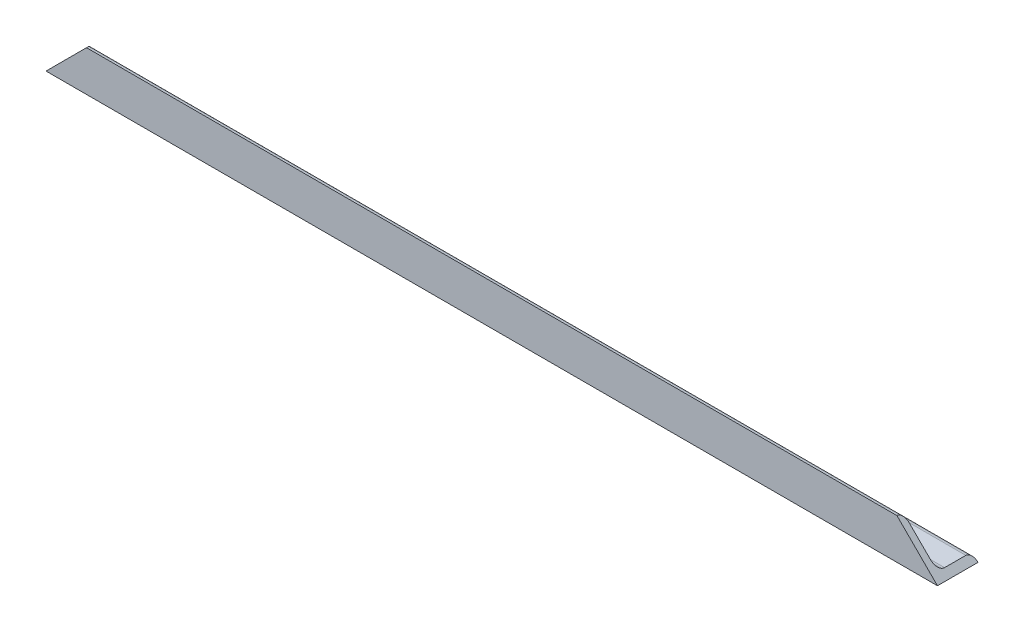
ISO-10303-21;
HEADER;
FILE_DESCRIPTION(('STEP AP214'),'2;1');
FILE_NAME('part.step','',(''),(''),'','','');
FILE_SCHEMA(('AUTOMOTIVE_DESIGN { 1 0 10303 214 1 1 1 1 }'));
ENDSEC;
DATA;
#1=APPLICATION_CONTEXT('core data for automotive mechanical design processes');
#2=APPLICATION_PROTOCOL_DEFINITION('international standard','automotive_design',2000,#1);
#3=PRODUCT_CONTEXT('',#1,'mechanical');
#4=PRODUCT('Part','Part','',(#3));
#5=PRODUCT_RELATED_PRODUCT_CATEGORY('part','',(#4));
#6=PRODUCT_DEFINITION_FORMATION('','',#4);
#7=PRODUCT_DEFINITION_CONTEXT('part definition',#1,'design');
#8=PRODUCT_DEFINITION('design','',#6,#7);
#9=PRODUCT_DEFINITION_SHAPE('','',#8);
#10=(LENGTH_UNIT() NAMED_UNIT(*) SI_UNIT(.MILLI.,.METRE.));
#11=(NAMED_UNIT(*) PLANE_ANGLE_UNIT() SI_UNIT($,.RADIAN.));
#12=(NAMED_UNIT(*) SI_UNIT($,.STERADIAN.) SOLID_ANGLE_UNIT());
#13=UNCERTAINTY_MEASURE_WITH_UNIT(LENGTH_MEASURE(1.E-05),#10,'distance_accuracy_value','');
#14=(GEOMETRIC_REPRESENTATION_CONTEXT(3) GLOBAL_UNCERTAINTY_ASSIGNED_CONTEXT((#13)) GLOBAL_UNIT_ASSIGNED_CONTEXT((#10,
#11,#12)) REPRESENTATION_CONTEXT('',''));
#15=CARTESIAN_POINT('',(0.,0.,0.));
#16=DIRECTION('',(0.,0.,1.));
#17=DIRECTION('',(1.,0.,0.));
#18=AXIS2_PLACEMENT_3D('',#15,#16,#17);
#19=CARTESIAN_POINT('',(440.,0.,-20.));
#20=DIRECTION('',(0.,1.,0.));
#21=DIRECTION('',(0.,0.,1.));
#22=AXIS2_PLACEMENT_3D('',#19,#20,#21);
#23=PLANE('',#22);
#24=DIRECTION('',(0.,0.,-1.));
#25=VECTOR('',#24,1.);
#26=CARTESIAN_POINT('',(0.,0.,-20.));
#27=LINE('',#26,#25);
#28=CARTESIAN_POINT('',(0.,0.,0.));
#29=VERTEX_POINT('',#28);
#30=CARTESIAN_POINT('',(0.,0.,-20.));
#31=VERTEX_POINT('',#30);
#32=EDGE_CURVE('E119',#29,#31,#27,.T.);
#33=ORIENTED_EDGE('',*,*,#32,.T.);
#34=DIRECTION('',(-1.,0.,0.));
#35=VECTOR('',#34,1.);
#36=CARTESIAN_POINT('',(440.,0.,-20.));
#37=LINE('',#36,#35);
#38=CARTESIAN_POINT('',(440.,0.,-20.));
#39=VERTEX_POINT('',#38);
#40=EDGE_CURVE('E13',#39,#31,#37,.T.);
#41=ORIENTED_EDGE('',*,*,#40,.F.);
#42=DIRECTION('',(0.,0.,-1.));
#43=VECTOR('',#42,1.);
#44=CARTESIAN_POINT('',(440.,0.,-20.));
#45=LINE('',#44,#43);
#46=CARTESIAN_POINT('',(440.,0.,0.));
#47=VERTEX_POINT('',#46);
#48=EDGE_CURVE('E130',#47,#39,#45,.T.);
#49=ORIENTED_EDGE('',*,*,#48,.F.);
#50=DIRECTION('',(-1.,0.,0.));
#51=VECTOR('',#50,1.);
#52=CARTESIAN_POINT('',(440.,0.,0.));
#53=LINE('',#52,#51);
#54=EDGE_CURVE('E136',#47,#29,#53,.T.);
#55=ORIENTED_EDGE('',*,*,#54,.T.);
#56=EDGE_LOOP('',(#33,#41,#49,#55));
#57=FACE_BOUND('',#56,.T.);
#58=ADVANCED_FACE('F65',(#57),#23,.F.);
#59=CARTESIAN_POINT('',(440.,0.,-17.));
#60=DIRECTION('',(-1.,0.,0.));
#61=DIRECTION('',(0.,0.,1.));
#62=AXIS2_PLACEMENT_3D('',#59,#60,#61);
#63=CYLINDRICAL_SURFACE('',#62,3.);
#64=ORIENTED_EDGE('',*,*,#40,.T.);
#65=CARTESIAN_POINT('',(0.,0.,-17.));
#66=DIRECTION('',(0.707106781186548,-0.707106781186548,0.));
#67=DIRECTION('',(-0.707106781186548,-0.707106781186548,0.));
#68=AXIS2_PLACEMENT_3D('',#65,#66,#67);
#69=ELLIPSE('',#68,4.24264068711928,3.);
#70=CARTESIAN_POINT('',(3.00000000000006,3.,-17.));
#71=VERTEX_POINT('',#70);
#72=EDGE_CURVE('E125',#31,#71,#69,.T.);
#73=ORIENTED_EDGE('',*,*,#72,.T.);
#74=DIRECTION('',(-1.,0.,0.));
#75=VECTOR('',#74,1.);
#76=CARTESIAN_POINT('',(440.,3.,-17.));
#77=LINE('',#76,#75);
#78=CARTESIAN_POINT('',(437.,3.,-17.));
#79=VERTEX_POINT('',#78);
#80=EDGE_CURVE('E74',#79,#71,#77,.T.);
#81=ORIENTED_EDGE('',*,*,#80,.F.);
#82=CARTESIAN_POINT('',(440.,0.,-17.));
#83=DIRECTION('',(-0.707106781186549,-0.707106781186546,0.));
#84=DIRECTION('',(-0.707106781186546,0.707106781186549,0.));
#85=AXIS2_PLACEMENT_3D('',#82,#83,#84);
#86=ELLIPSE('',#85,4.24264068711928,3.);
#87=EDGE_CURVE('E131',#79,#39,#86,.T.);
#88=ORIENTED_EDGE('',*,*,#87,.T.);
#89=EDGE_LOOP('',(#64,#73,#81,#88));
#90=FACE_BOUND('',#89,.T.);
#91=ADVANCED_FACE('F173',(#90),#63,.T.);
#92=CARTESIAN_POINT('',(440.,3.,-6.5));
#93=DIRECTION('',(0.,-1.,0.));
#94=DIRECTION('',(0.,0.,-1.));
#95=AXIS2_PLACEMENT_3D('',#92,#93,#94);
#96=PLANE('',#95);
#97=ORIENTED_EDGE('',*,*,#80,.T.);
#98=DIRECTION('',(0.,0.,1.));
#99=VECTOR('',#98,1.);
#100=CARTESIAN_POINT('',(3.00000000000006,3.,-6.5));
#101=LINE('',#100,#99);
#102=CARTESIAN_POINT('',(3.00000000000006,3.,-6.5));
#103=VERTEX_POINT('',#102);
#104=EDGE_CURVE('E169',#71,#103,#101,.T.);
#105=ORIENTED_EDGE('',*,*,#104,.T.);
#106=DIRECTION('',(-1.,0.,0.));
#107=VECTOR('',#106,1.);
#108=CARTESIAN_POINT('',(440.,3.,-6.5));
#109=LINE('',#108,#107);
#110=CARTESIAN_POINT('',(437.,3.,-6.5));
#111=VERTEX_POINT('',#110);
#112=EDGE_CURVE('E158',#111,#103,#109,.T.);
#113=ORIENTED_EDGE('',*,*,#112,.F.);
#114=DIRECTION('',(0.,0.,-1.));
#115=VECTOR('',#114,1.);
#116=CARTESIAN_POINT('',(437.,3.,-6.5));
#117=LINE('',#116,#115);
#118=EDGE_CURVE('E170',#111,#79,#117,.T.);
#119=ORIENTED_EDGE('',*,*,#118,.T.);
#120=EDGE_LOOP('',(#97,#105,#113,#119));
#121=FACE_BOUND('',#120,.T.);
#122=ADVANCED_FACE('F167',(#121),#96,.F.);
#123=CARTESIAN_POINT('',(440.,6.5,-6.5));
#124=DIRECTION('',(-1.,0.,0.));
#125=DIRECTION('',(0.,0.,1.));
#126=AXIS2_PLACEMENT_3D('',#123,#124,#125);
#127=CYLINDRICAL_SURFACE('',#126,3.5);
#128=ORIENTED_EDGE('',*,*,#112,.T.);
#129=CARTESIAN_POINT('',(6.50000000000006,6.5,-6.5));
#130=DIRECTION('',(0.707106781186548,-0.707106781186548,0.));
#131=DIRECTION('',(-0.707106781186548,-0.707106781186548,0.));
#132=AXIS2_PLACEMENT_3D('',#129,#130,#131);
#133=ELLIPSE('',#132,4.94974746830583,3.5);
#134=CARTESIAN_POINT('',(6.50000000000001,6.50000000000001,-3.));
#135=VERTEX_POINT('',#134);
#136=EDGE_CURVE('E182',#103,#135,#133,.F.);
#137=ORIENTED_EDGE('',*,*,#136,.T.);
#138=DIRECTION('',(-1.,0.,0.));
#139=VECTOR('',#138,1.);
#140=CARTESIAN_POINT('',(440.,6.5,-3.));
#141=LINE('',#140,#139);
#142=CARTESIAN_POINT('',(433.5,6.5,-3.));
#143=VERTEX_POINT('',#142);
#144=EDGE_CURVE('E154',#143,#135,#141,.T.);
#145=ORIENTED_EDGE('',*,*,#144,.F.);
#146=CARTESIAN_POINT('',(433.5,6.5,-6.5));
#147=DIRECTION('',(-0.707106781186549,-0.707106781186546,0.));
#148=DIRECTION('',(-0.707106781186546,0.707106781186549,0.));
#149=AXIS2_PLACEMENT_3D('',#146,#147,#148);
#150=ELLIPSE('',#149,4.94974746830583,3.5);
#151=EDGE_CURVE('E189',#143,#111,#150,.F.);
#152=ORIENTED_EDGE('',*,*,#151,.T.);
#153=EDGE_LOOP('',(#128,#137,#145,#152));
#154=FACE_BOUND('',#153,.T.);
#155=ADVANCED_FACE('F198',(#154),#127,.F.);
#156=CARTESIAN_POINT('',(440.,17.,-3.));
#157=DIRECTION('',(0.,0.,1.));
#158=DIRECTION('',(0.,-1.,0.));
#159=AXIS2_PLACEMENT_3D('',#156,#157,#158);
#160=PLANE('',#159);
#161=ORIENTED_EDGE('',*,*,#144,.T.);
#162=DIRECTION('',(0.707106781186548,0.707106781186548,0.));
#163=VECTOR('',#162,1.);
#164=CARTESIAN_POINT('',(228.5,228.5,-3.00000000000001));
#165=LINE('',#164,#163);
#166=CARTESIAN_POINT('',(17.,17.,-3.));
#167=VERTEX_POINT('',#166);
#168=EDGE_CURVE('E205',#135,#167,#165,.T.);
#169=ORIENTED_EDGE('',*,*,#168,.T.);
#170=DIRECTION('',(-1.,0.,0.));
#171=VECTOR('',#170,1.);
#172=CARTESIAN_POINT('',(440.,17.,-3.));
#173=LINE('',#172,#171);
#174=CARTESIAN_POINT('',(423.,17.,-3.));
#175=VERTEX_POINT('',#174);
#176=EDGE_CURVE('E147',#175,#167,#173,.T.);
#177=ORIENTED_EDGE('',*,*,#176,.F.);
#178=DIRECTION('',(0.707106781186546,-0.707106781186549,0.));
#179=VECTOR('',#178,1.);
#180=CARTESIAN_POINT('',(431.5,8.50000000000002,-3.));
#181=LINE('',#180,#179);
#182=EDGE_CURVE('E180',#175,#143,#181,.T.);
#183=ORIENTED_EDGE('',*,*,#182,.T.);
#184=EDGE_LOOP('',(#161,#169,#177,#183));
#185=FACE_BOUND('',#184,.T.);
#186=ADVANCED_FACE('F203',(#185),#160,.F.);
#187=CARTESIAN_POINT('',(440.,17.,0.));
#188=DIRECTION('',(-1.,0.,0.));
#189=DIRECTION('',(0.,0.,1.));
#190=AXIS2_PLACEMENT_3D('',#187,#188,#189);
#191=CYLINDRICAL_SURFACE('',#190,3.);
#192=ORIENTED_EDGE('',*,*,#176,.T.);
#193=CARTESIAN_POINT('',(17.,17.,0.));
#194=DIRECTION('',(0.707106781186548,-0.707106781186548,0.));
#195=DIRECTION('',(-0.707106781186548,-0.707106781186548,0.));
#196=AXIS2_PLACEMENT_3D('',#193,#194,#195);
#197=ELLIPSE('',#196,4.24264068711928,3.);
#198=CARTESIAN_POINT('',(20.,20.,0.));
#199=VERTEX_POINT('',#198);
#200=EDGE_CURVE('E141',#167,#199,#197,.T.);
#201=ORIENTED_EDGE('',*,*,#200,.T.);
#202=DIRECTION('',(-1.,0.,0.));
#203=VECTOR('',#202,1.);
#204=CARTESIAN_POINT('',(440.,20.,0.));
#205=LINE('',#204,#203);
#206=CARTESIAN_POINT('',(420.,20.0000000000001,0.));
#207=VERTEX_POINT('',#206);
#208=EDGE_CURVE('E139',#207,#199,#205,.T.);
#209=ORIENTED_EDGE('',*,*,#208,.F.);
#210=CARTESIAN_POINT('',(423.,17.,0.));
#211=DIRECTION('',(-0.707106781186549,-0.707106781186546,0.));
#212=DIRECTION('',(-0.707106781186546,0.707106781186549,0.));
#213=AXIS2_PLACEMENT_3D('',#210,#211,#212);
#214=ELLIPSE('',#213,4.24264068711928,3.);
#215=EDGE_CURVE('E175',#207,#175,#214,.T.);
#216=ORIENTED_EDGE('',*,*,#215,.T.);
#217=EDGE_LOOP('',(#192,#201,#209,#216));
#218=FACE_BOUND('',#217,.T.);
#219=ADVANCED_FACE('F207',(#218),#191,.T.);
#220=CARTESIAN_POINT('',(440.,20.,0.));
#221=DIRECTION('',(0.,0.,-1.));
#222=DIRECTION('',(-1.,0.,0.));
#223=AXIS2_PLACEMENT_3D('',#220,#221,#222);
#224=PLANE('',#223);
#225=ORIENTED_EDGE('',*,*,#208,.T.);
#226=DIRECTION('',(0.707106781186548,0.707106781186548,0.));
#227=VECTOR('',#226,1.);
#228=CARTESIAN_POINT('',(20.,20.,0.));
#229=LINE('',#228,#227);
#230=EDGE_CURVE('E122',#29,#199,#229,.T.);
#231=ORIENTED_EDGE('',*,*,#230,.F.);
#232=ORIENTED_EDGE('',*,*,#54,.F.);
#233=DIRECTION('',(0.707106781186546,-0.707106781186549,0.));
#234=VECTOR('',#233,1.);
#235=CARTESIAN_POINT('',(420.,20.0000000000001,0.));
#236=LINE('',#235,#234);
#237=EDGE_CURVE('E80',#207,#47,#236,.T.);
#238=ORIENTED_EDGE('',*,*,#237,.F.);
#239=EDGE_LOOP('',(#225,#231,#232,#238));
#240=FACE_BOUND('',#239,.T.);
#241=ADVANCED_FACE('F135',(#240),#224,.F.);
#242=CARTESIAN_POINT('',(20.,20.,-20.));
#243=DIRECTION('',(0.707106781186548,-0.707106781186548,0.));
#244=DIRECTION('',(0.707106781186548,0.707106781186548,0.));
#245=AXIS2_PLACEMENT_3D('',#242,#243,#244);
#246=PLANE('',#245);
#247=ORIENTED_EDGE('',*,*,#32,.F.);
#248=ORIENTED_EDGE('',*,*,#230,.T.);
#249=ORIENTED_EDGE('',*,*,#200,.F.);
#250=ORIENTED_EDGE('',*,*,#168,.F.);
#251=ORIENTED_EDGE('',*,*,#136,.F.);
#252=ORIENTED_EDGE('',*,*,#104,.F.);
#253=ORIENTED_EDGE('',*,*,#72,.F.);
#254=EDGE_LOOP('',(#247,#248,#249,#250,#251,#252,#253));
#255=FACE_BOUND('',#254,.T.);
#256=ADVANCED_FACE('F121',(#255),#246,.F.);
#257=CARTESIAN_POINT('',(420.,20.0000000000001,-20.));
#258=DIRECTION('',(-0.707106781186549,-0.707106781186546,0.));
#259=DIRECTION('',(0.707106781186546,-0.707106781186549,0.));
#260=AXIS2_PLACEMENT_3D('',#257,#258,#259);
#261=PLANE('',#260);
#262=ORIENTED_EDGE('',*,*,#118,.F.);
#263=ORIENTED_EDGE('',*,*,#151,.F.);
#264=ORIENTED_EDGE('',*,*,#182,.F.);
#265=ORIENTED_EDGE('',*,*,#215,.F.);
#266=ORIENTED_EDGE('',*,*,#237,.T.);
#267=ORIENTED_EDGE('',*,*,#48,.T.);
#268=ORIENTED_EDGE('',*,*,#87,.F.);
#269=EDGE_LOOP('',(#262,#263,#264,#265,#266,#267,#268));
#270=FACE_BOUND('',#269,.T.);
#271=ADVANCED_FACE('F200',(#270),#261,.F.);
#272=CLOSED_SHELL('',(#58,#91,#122,#155,#186,#219,#241,#256,#271));
#273=MANIFOLD_SOLID_BREP('B2',#272);
#274=ADVANCED_BREP_SHAPE_REPRESENTATION('',(#18,#273),#14);
#275=SHAPE_DEFINITION_REPRESENTATION(#9,#274);
ENDSEC;
END-ISO-10303-21;
